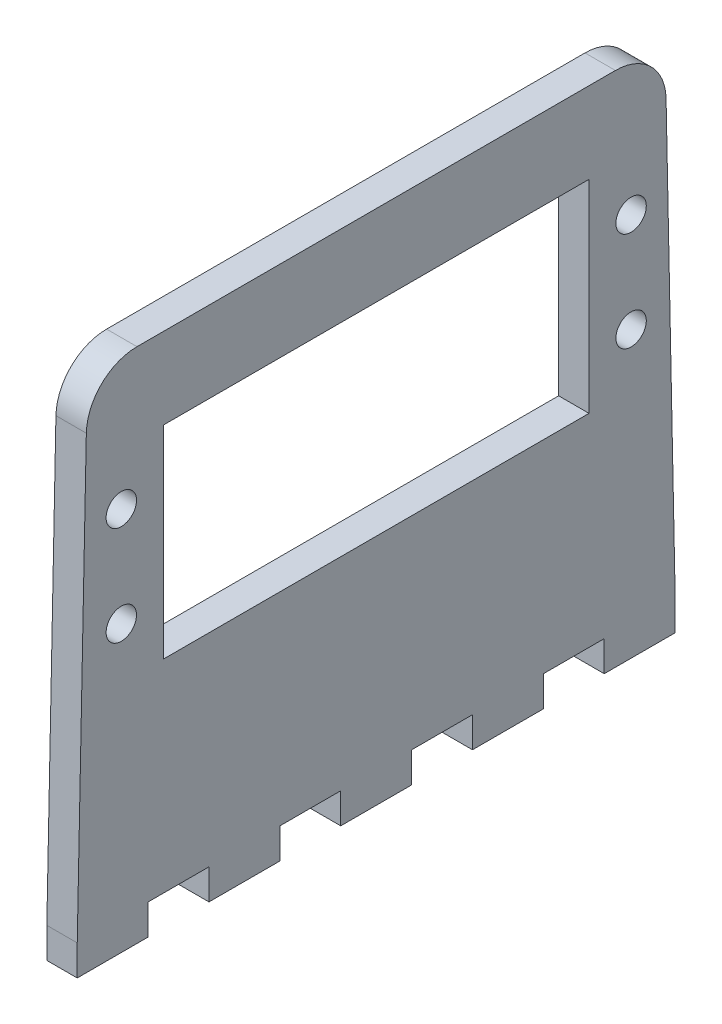
ISO-10303-21;
HEADER;
FILE_DESCRIPTION(('STEP AP214'),'2;1');
FILE_NAME('part.step','',(''),(''),'','','');
FILE_SCHEMA(('AUTOMOTIVE_DESIGN { 1 0 10303 214 1 1 1 1 }'));
ENDSEC;
DATA;
#1=APPLICATION_CONTEXT('core data for automotive mechanical design processes');
#2=APPLICATION_PROTOCOL_DEFINITION('international standard','automotive_design',2000,#1);
#3=PRODUCT_CONTEXT('',#1,'mechanical');
#4=PRODUCT('Part','Part','',(#3));
#5=PRODUCT_RELATED_PRODUCT_CATEGORY('part','',(#4));
#6=PRODUCT_DEFINITION_FORMATION('','',#4);
#7=PRODUCT_DEFINITION_CONTEXT('part definition',#1,'design');
#8=PRODUCT_DEFINITION('design','',#6,#7);
#9=PRODUCT_DEFINITION_SHAPE('','',#8);
#10=(LENGTH_UNIT() NAMED_UNIT(*) SI_UNIT(.MILLI.,.METRE.));
#11=(NAMED_UNIT(*) PLANE_ANGLE_UNIT() SI_UNIT($,.RADIAN.));
#12=(NAMED_UNIT(*) SI_UNIT($,.STERADIAN.) SOLID_ANGLE_UNIT());
#13=UNCERTAINTY_MEASURE_WITH_UNIT(LENGTH_MEASURE(1.E-05),#10,'distance_accuracy_value','');
#14=(GEOMETRIC_REPRESENTATION_CONTEXT(3) GLOBAL_UNCERTAINTY_ASSIGNED_CONTEXT((#13)) GLOBAL_UNIT_ASSIGNED_CONTEXT((#10,
#11,#12)) REPRESENTATION_CONTEXT('',''));
#15=CARTESIAN_POINT('',(0.,0.,0.));
#16=DIRECTION('',(0.,0.,1.));
#17=DIRECTION('',(1.,0.,0.));
#18=AXIS2_PLACEMENT_3D('',#15,#16,#17);
#19=CARTESIAN_POINT('',(3.,0.,0.));
#20=DIRECTION('',(-1.,0.,0.));
#21=DIRECTION('',(0.,0.,1.));
#22=AXIS2_PLACEMENT_3D('',#19,#20,#21);
#23=PLANE('',#22);
#24=DIRECTION('',(0.,0.,1.));
#25=VECTOR('',#24,1.);
#26=CARTESIAN_POINT('',(3.,48.,32.));
#27=LINE('',#26,#25);
#28=CARTESIAN_POINT('',(3.,48.,-20.1030817149342));
#29=VERTEX_POINT('',#28);
#30=CARTESIAN_POINT('',(3.,48.,27.1030817149343));
#31=VERTEX_POINT('',#30);
#32=EDGE_CURVE('E307',#29,#31,#27,.T.);
#33=ORIENTED_EDGE('',*,*,#32,.T.);
#34=CARTESIAN_POINT('',(3.,43.,27.1030817149343));
#35=DIRECTION('',(-1.,0.,0.));
#36=DIRECTION('',(0.,0.,1.));
#37=AXIS2_PLACEMENT_3D('',#34,#35,#36);
#38=CIRCLE('',#37,5.);
#39=CARTESIAN_POINT('',(3.,43.1041440684092,32.1019969985748));
#40=VERTEX_POINT('',#39);
#41=EDGE_CURVE('E41',#31,#40,#38,.F.);
#42=ORIENTED_EDGE('',*,*,#41,.T.);
#43=DIRECTION('',(0.,-0.999783056728112,0.0208288136818384));
#44=VECTOR('',#43,1.);
#45=CARTESIAN_POINT('',(3.,0.,33.0000000000001));
#46=LINE('',#45,#44);
#47=CARTESIAN_POINT('',(3.,0.,33.0000000000001));
#48=VERTEX_POINT('',#47);
#49=EDGE_CURVE('E309',#40,#48,#46,.T.);
#50=ORIENTED_EDGE('',*,*,#49,.T.);
#51=DIRECTION('',(0.,-1.,0.));
#52=VECTOR('',#51,1.);
#53=CARTESIAN_POINT('',(3.,-3.,33.0000000000001));
#54=LINE('',#53,#52);
#55=CARTESIAN_POINT('',(3.,-3.,33.0000000000001));
#56=VERTEX_POINT('',#55);
#57=EDGE_CURVE('E265',#48,#56,#54,.T.);
#58=ORIENTED_EDGE('',*,*,#57,.T.);
#59=DIRECTION('',(0.,0.,-1.));
#60=VECTOR('',#59,1.);
#61=CARTESIAN_POINT('',(3.,-3.,26.0000000000001));
#62=LINE('',#61,#60);
#63=CARTESIAN_POINT('',(3.,-3.,26.0000000000001));
#64=VERTEX_POINT('',#63);
#65=EDGE_CURVE('E268',#56,#64,#62,.T.);
#66=ORIENTED_EDGE('',*,*,#65,.T.);
#67=DIRECTION('',(0.,1.,0.));
#68=VECTOR('',#67,1.);
#69=CARTESIAN_POINT('',(3.,0.,26.0000000000001));
#70=LINE('',#69,#68);
#71=CARTESIAN_POINT('',(3.,0.,26.0000000000001));
#72=VERTEX_POINT('',#71);
#73=EDGE_CURVE('E271',#64,#72,#70,.T.);
#74=ORIENTED_EDGE('',*,*,#73,.T.);
#75=DIRECTION('',(0.,0.,-1.));
#76=VECTOR('',#75,1.);
#77=CARTESIAN_POINT('',(3.,0.,20.0000000000001));
#78=LINE('',#77,#76);
#79=CARTESIAN_POINT('',(3.,0.,20.0000000000001));
#80=VERTEX_POINT('',#79);
#81=EDGE_CURVE('E273',#72,#80,#78,.T.);
#82=ORIENTED_EDGE('',*,*,#81,.T.);
#83=DIRECTION('',(0.,-1.,0.));
#84=VECTOR('',#83,1.);
#85=CARTESIAN_POINT('',(3.,-3.,20.0000000000001));
#86=LINE('',#85,#84);
#87=CARTESIAN_POINT('',(3.,-3.,20.0000000000001));
#88=VERTEX_POINT('',#87);
#89=EDGE_CURVE('E275',#80,#88,#86,.T.);
#90=ORIENTED_EDGE('',*,*,#89,.T.);
#91=DIRECTION('',(0.,0.,-1.));
#92=VECTOR('',#91,1.);
#93=CARTESIAN_POINT('',(3.,-3.,13.0000000000001));
#94=LINE('',#93,#92);
#95=CARTESIAN_POINT('',(3.,-3.,13.0000000000001));
#96=VERTEX_POINT('',#95);
#97=EDGE_CURVE('E277',#88,#96,#94,.T.);
#98=ORIENTED_EDGE('',*,*,#97,.T.);
#99=DIRECTION('',(0.,1.,0.));
#100=VECTOR('',#99,1.);
#101=CARTESIAN_POINT('',(3.,0.,13.0000000000001));
#102=LINE('',#101,#100);
#103=CARTESIAN_POINT('',(3.,0.,13.0000000000001));
#104=VERTEX_POINT('',#103);
#105=EDGE_CURVE('E279',#96,#104,#102,.T.);
#106=ORIENTED_EDGE('',*,*,#105,.T.);
#107=DIRECTION('',(0.,0.,-1.));
#108=VECTOR('',#107,1.);
#109=CARTESIAN_POINT('',(3.,0.,7.00000000000027));
#110=LINE('',#109,#108);
#111=CARTESIAN_POINT('',(3.,0.,7.00000000000027));
#112=VERTEX_POINT('',#111);
#113=EDGE_CURVE('E281',#104,#112,#110,.T.);
#114=ORIENTED_EDGE('',*,*,#113,.T.);
#115=DIRECTION('',(0.,-1.,0.));
#116=VECTOR('',#115,1.);
#117=CARTESIAN_POINT('',(3.,-3.,7.00000000000018));
#118=LINE('',#117,#116);
#119=CARTESIAN_POINT('',(3.,-3.,7.00000000000018));
#120=VERTEX_POINT('',#119);
#121=EDGE_CURVE('E283',#112,#120,#118,.T.);
#122=ORIENTED_EDGE('',*,*,#121,.T.);
#123=DIRECTION('',(0.,0.,-1.));
#124=VECTOR('',#123,1.);
#125=CARTESIAN_POINT('',(3.,-3.,0.));
#126=LINE('',#125,#124);
#127=CARTESIAN_POINT('',(3.,-3.,0.));
#128=VERTEX_POINT('',#127);
#129=EDGE_CURVE('E285',#120,#128,#126,.T.);
#130=ORIENTED_EDGE('',*,*,#129,.T.);
#131=DIRECTION('',(0.,1.,0.));
#132=VECTOR('',#131,1.);
#133=CARTESIAN_POINT('',(3.,0.,0.));
#134=LINE('',#133,#132);
#135=CARTESIAN_POINT('',(3.,0.,0.));
#136=VERTEX_POINT('',#135);
#137=EDGE_CURVE('E287',#128,#136,#134,.T.);
#138=ORIENTED_EDGE('',*,*,#137,.T.);
#139=DIRECTION('',(0.,0.,-1.));
#140=VECTOR('',#139,1.);
#141=CARTESIAN_POINT('',(3.,0.,-6.00000000000001));
#142=LINE('',#141,#140);
#143=CARTESIAN_POINT('',(3.,0.,-6.00000000000001));
#144=VERTEX_POINT('',#143);
#145=EDGE_CURVE('E289',#136,#144,#142,.T.);
#146=ORIENTED_EDGE('',*,*,#145,.T.);
#147=DIRECTION('',(0.,-1.,0.));
#148=VECTOR('',#147,1.);
#149=CARTESIAN_POINT('',(3.,-3.,-6.00000000000001));
#150=LINE('',#149,#148);
#151=CARTESIAN_POINT('',(3.,-3.,-6.00000000000001));
#152=VERTEX_POINT('',#151);
#153=EDGE_CURVE('E291',#144,#152,#150,.T.);
#154=ORIENTED_EDGE('',*,*,#153,.T.);
#155=DIRECTION('',(0.,0.,-1.));
#156=VECTOR('',#155,1.);
#157=CARTESIAN_POINT('',(3.,-3.,-13.));
#158=LINE('',#157,#156);
#159=CARTESIAN_POINT('',(3.,-3.,-13.));
#160=VERTEX_POINT('',#159);
#161=EDGE_CURVE('E293',#152,#160,#158,.T.);
#162=ORIENTED_EDGE('',*,*,#161,.T.);
#163=DIRECTION('',(0.,1.,0.));
#164=VECTOR('',#163,1.);
#165=CARTESIAN_POINT('',(3.,0.,-13.));
#166=LINE('',#165,#164);
#167=CARTESIAN_POINT('',(3.,0.,-13.));
#168=VERTEX_POINT('',#167);
#169=EDGE_CURVE('E295',#160,#168,#166,.T.);
#170=ORIENTED_EDGE('',*,*,#169,.T.);
#171=DIRECTION('',(0.,0.,-1.));
#172=VECTOR('',#171,1.);
#173=CARTESIAN_POINT('',(3.,0.,-19.));
#174=LINE('',#173,#172);
#175=CARTESIAN_POINT('',(3.,0.,-19.));
#176=VERTEX_POINT('',#175);
#177=EDGE_CURVE('E297',#168,#176,#174,.T.);
#178=ORIENTED_EDGE('',*,*,#177,.T.);
#179=DIRECTION('',(0.,-1.,0.));
#180=VECTOR('',#179,1.);
#181=CARTESIAN_POINT('',(3.,-3.,-19.));
#182=LINE('',#181,#180);
#183=CARTESIAN_POINT('',(3.,-3.,-19.));
#184=VERTEX_POINT('',#183);
#185=EDGE_CURVE('E299',#176,#184,#182,.T.);
#186=ORIENTED_EDGE('',*,*,#185,.T.);
#187=DIRECTION('',(0.,0.,-1.));
#188=VECTOR('',#187,1.);
#189=CARTESIAN_POINT('',(3.,-3.,-26.));
#190=LINE('',#189,#188);
#191=CARTESIAN_POINT('',(3.,-3.,-26.));
#192=VERTEX_POINT('',#191);
#193=EDGE_CURVE('E301',#184,#192,#190,.T.);
#194=ORIENTED_EDGE('',*,*,#193,.T.);
#195=DIRECTION('',(0.,1.,0.));
#196=VECTOR('',#195,1.);
#197=CARTESIAN_POINT('',(3.,0.,-26.0000000000001));
#198=LINE('',#197,#196);
#199=CARTESIAN_POINT('',(3.,0.,-26.0000000000001));
#200=VERTEX_POINT('',#199);
#201=EDGE_CURVE('E303',#192,#200,#198,.T.);
#202=ORIENTED_EDGE('',*,*,#201,.T.);
#203=DIRECTION('',(0.,0.999783056728112,0.0208288136818374));
#204=VECTOR('',#203,1.);
#205=CARTESIAN_POINT('',(3.,48.,-25.));
#206=LINE('',#205,#204);
#207=CARTESIAN_POINT('',(3.,43.1041440684092,-25.1019969985748));
#208=VERTEX_POINT('',#207);
#209=EDGE_CURVE('E305',#200,#208,#206,.T.);
#210=ORIENTED_EDGE('',*,*,#209,.T.);
#211=CARTESIAN_POINT('',(3.,43.,-20.1030817149343));
#212=DIRECTION('',(-1.,0.,0.));
#213=DIRECTION('',(0.,0.,1.));
#214=AXIS2_PLACEMENT_3D('',#211,#212,#213);
#215=CIRCLE('',#214,5.);
#216=EDGE_CURVE('E425',#208,#29,#215,.F.);
#217=ORIENTED_EDGE('',*,*,#216,.T.);
#218=EDGE_LOOP('',(#33,#42,#50,#58,#66,#74,#82,#90,#98,#106,#114,#122,#130,#138,#146,#154,#162,
#170,#178,#186,#194,#202,#210,#217));
#219=FACE_BOUND('',#218,.T.);
#220=DIRECTION('',(0.,1.,0.));
#221=VECTOR('',#220,1.);
#222=CARTESIAN_POINT('',(3.,40.,-17.5));
#223=LINE('',#222,#221);
#224=CARTESIAN_POINT('',(3.,20.,-17.5));
#225=VERTEX_POINT('',#224);
#226=CARTESIAN_POINT('',(3.,40.,-17.5));
#227=VERTEX_POINT('',#226);
#228=EDGE_CURVE('E221',#225,#227,#223,.T.);
#229=ORIENTED_EDGE('',*,*,#228,.F.);
#230=DIRECTION('',(0.,0.,-1.));
#231=VECTOR('',#230,1.);
#232=CARTESIAN_POINT('',(3.,20.,24.5));
#233=LINE('',#232,#231);
#234=CARTESIAN_POINT('',(3.,20.,24.5));
#235=VERTEX_POINT('',#234);
#236=EDGE_CURVE('E247',#235,#225,#233,.T.);
#237=ORIENTED_EDGE('',*,*,#236,.F.);
#238=DIRECTION('',(0.,-1.,0.));
#239=VECTOR('',#238,1.);
#240=CARTESIAN_POINT('',(3.,40.,24.5));
#241=LINE('',#240,#239);
#242=CARTESIAN_POINT('',(3.,40.,24.5));
#243=VERTEX_POINT('',#242);
#244=EDGE_CURVE('E245',#243,#235,#241,.T.);
#245=ORIENTED_EDGE('',*,*,#244,.F.);
#246=DIRECTION('',(0.,0.,1.));
#247=VECTOR('',#246,1.);
#248=CARTESIAN_POINT('',(3.,40.,24.5));
#249=LINE('',#248,#247);
#250=EDGE_CURVE('E231',#227,#243,#249,.T.);
#251=ORIENTED_EDGE('',*,*,#250,.F.);
#252=EDGE_LOOP('',(#229,#237,#245,#251));
#253=FACE_BOUND('',#252,.T.);
#254=CARTESIAN_POINT('',(3.,34.9,-21.65));
#255=DIRECTION('',(1.,0.,0.));
#256=DIRECTION('',(0.,0.,-1.));
#257=AXIS2_PLACEMENT_3D('',#254,#255,#256);
#258=CIRCLE('',#257,1.5);
#259=CARTESIAN_POINT('',(3.,34.9,-23.15));
#260=VERTEX_POINT('',#259);
#261=EDGE_CURVE('E254',#260,#260,#258,.T.);
#262=ORIENTED_EDGE('',*,*,#261,.F.);
#263=EDGE_LOOP('',(#262));
#264=FACE_BOUND('',#263,.T.);
#265=CARTESIAN_POINT('',(3.,25.1,-21.65));
#266=DIRECTION('',(1.,0.,0.));
#267=DIRECTION('',(0.,0.,1.));
#268=AXIS2_PLACEMENT_3D('',#265,#266,#267);
#269=CIRCLE('',#268,1.5);
#270=CARTESIAN_POINT('',(3.,25.1,-20.15));
#271=VERTEX_POINT('',#270);
#272=EDGE_CURVE('E840',#271,#271,#269,.T.);
#273=ORIENTED_EDGE('',*,*,#272,.F.);
#274=EDGE_LOOP('',(#273));
#275=FACE_BOUND('',#274,.T.);
#276=CARTESIAN_POINT('',(3.,34.9,28.65));
#277=DIRECTION('',(1.,0.,0.));
#278=DIRECTION('',(0.,0.,1.));
#279=AXIS2_PLACEMENT_3D('',#276,#277,#278);
#280=CIRCLE('',#279,1.5);
#281=CARTESIAN_POINT('',(3.,34.9,30.15));
#282=VERTEX_POINT('',#281);
#283=EDGE_CURVE('E834',#282,#282,#280,.T.);
#284=ORIENTED_EDGE('',*,*,#283,.F.);
#285=EDGE_LOOP('',(#284));
#286=FACE_BOUND('',#285,.T.);
#287=CARTESIAN_POINT('',(3.,25.1,28.65));
#288=DIRECTION('',(1.,0.,0.));
#289=DIRECTION('',(0.,0.,-1.));
#290=AXIS2_PLACEMENT_3D('',#287,#288,#289);
#291=CIRCLE('',#290,1.5);
#292=CARTESIAN_POINT('',(3.,25.1,27.15));
#293=VERTEX_POINT('',#292);
#294=EDGE_CURVE('E825',#293,#293,#291,.T.);
#295=ORIENTED_EDGE('',*,*,#294,.F.);
#296=EDGE_LOOP('',(#295));
#297=FACE_BOUND('',#296,.T.);
#298=ADVANCED_FACE('F33',(#219,#253,#264,#275,#286,#297),#23,.F.);
#299=CARTESIAN_POINT('',(0.,0.,0.));
#300=DIRECTION('',(-1.,0.,0.));
#301=DIRECTION('',(0.,0.,1.));
#302=AXIS2_PLACEMENT_3D('',#299,#300,#301);
#303=PLANE('',#302);
#304=CARTESIAN_POINT('',(0.,34.9,28.65));
#305=DIRECTION('',(1.,0.,0.));
#306=DIRECTION('',(0.,0.,1.));
#307=AXIS2_PLACEMENT_3D('',#304,#305,#306);
#308=CIRCLE('',#307,1.5);
#309=CARTESIAN_POINT('',(0.,34.9,30.15));
#310=VERTEX_POINT('',#309);
#311=EDGE_CURVE('E831',#310,#310,#308,.T.);
#312=ORIENTED_EDGE('',*,*,#311,.T.);
#313=EDGE_LOOP('',(#312));
#314=FACE_BOUND('',#313,.T.);
#315=CARTESIAN_POINT('',(0.,34.9,-21.65));
#316=DIRECTION('',(1.,0.,0.));
#317=DIRECTION('',(0.,0.,-1.));
#318=AXIS2_PLACEMENT_3D('',#315,#316,#317);
#319=CIRCLE('',#318,1.5);
#320=CARTESIAN_POINT('',(0.,34.9,-23.15));
#321=VERTEX_POINT('',#320);
#322=EDGE_CURVE('E843',#321,#321,#319,.T.);
#323=ORIENTED_EDGE('',*,*,#322,.T.);
#324=EDGE_LOOP('',(#323));
#325=FACE_BOUND('',#324,.T.);
#326=DIRECTION('',(0.,-0.999783056728112,0.0208288136818384));
#327=VECTOR('',#326,1.);
#328=CARTESIAN_POINT('',(0.,0.,33.0000000000001));
#329=LINE('',#328,#327);
#330=CARTESIAN_POINT('',(0.,43.1041440684092,32.1019969985748));
#331=VERTEX_POINT('',#330);
#332=CARTESIAN_POINT('',(0.,0.,33.0000000000001));
#333=VERTEX_POINT('',#332);
#334=EDGE_CURVE('E269',#331,#333,#329,.T.);
#335=ORIENTED_EDGE('',*,*,#334,.F.);
#336=CARTESIAN_POINT('',(0.,43.,27.1030817149343));
#337=DIRECTION('',(-1.,0.,0.));
#338=DIRECTION('',(0.,0.,1.));
#339=AXIS2_PLACEMENT_3D('',#336,#337,#338);
#340=CIRCLE('',#339,5.);
#341=CARTESIAN_POINT('',(0.,48.,27.1030817149343));
#342=VERTEX_POINT('',#341);
#343=EDGE_CURVE('E419',#331,#342,#340,.T.);
#344=ORIENTED_EDGE('',*,*,#343,.T.);
#345=DIRECTION('',(0.,0.,1.));
#346=VECTOR('',#345,1.);
#347=CARTESIAN_POINT('',(0.,48.,32.));
#348=LINE('',#347,#346);
#349=CARTESIAN_POINT('',(0.,48.,-20.1030817149342));
#350=VERTEX_POINT('',#349);
#351=EDGE_CURVE('E352',#350,#342,#348,.T.);
#352=ORIENTED_EDGE('',*,*,#351,.F.);
#353=CARTESIAN_POINT('',(0.,43.,-20.1030817149343));
#354=DIRECTION('',(-1.,0.,0.));
#355=DIRECTION('',(0.,0.,1.));
#356=AXIS2_PLACEMENT_3D('',#353,#354,#355);
#357=CIRCLE('',#356,5.);
#358=CARTESIAN_POINT('',(0.,43.1041440684092,-25.1019969985748));
#359=VERTEX_POINT('',#358);
#360=EDGE_CURVE('E417',#350,#359,#357,.T.);
#361=ORIENTED_EDGE('',*,*,#360,.T.);
#362=DIRECTION('',(0.,0.999783056728112,0.0208288136818374));
#363=VECTOR('',#362,1.);
#364=CARTESIAN_POINT('',(0.,48.,-25.));
#365=LINE('',#364,#363);
#366=CARTESIAN_POINT('',(0.,0.,-26.0000000000001));
#367=VERTEX_POINT('',#366);
#368=EDGE_CURVE('E350',#367,#359,#365,.T.);
#369=ORIENTED_EDGE('',*,*,#368,.F.);
#370=DIRECTION('',(0.,1.,0.));
#371=VECTOR('',#370,1.);
#372=CARTESIAN_POINT('',(0.,0.,-26.0000000000001));
#373=LINE('',#372,#371);
#374=CARTESIAN_POINT('',(0.,-3.,-26.));
#375=VERTEX_POINT('',#374);
#376=EDGE_CURVE('E348',#375,#367,#373,.T.);
#377=ORIENTED_EDGE('',*,*,#376,.F.);
#378=DIRECTION('',(0.,0.,-1.));
#379=VECTOR('',#378,1.);
#380=CARTESIAN_POINT('',(0.,-3.,-26.));
#381=LINE('',#380,#379);
#382=CARTESIAN_POINT('',(0.,-3.,-19.));
#383=VERTEX_POINT('',#382);
#384=EDGE_CURVE('E346',#383,#375,#381,.T.);
#385=ORIENTED_EDGE('',*,*,#384,.F.);
#386=DIRECTION('',(0.,-1.,0.));
#387=VECTOR('',#386,1.);
#388=CARTESIAN_POINT('',(0.,-3.,-19.));
#389=LINE('',#388,#387);
#390=CARTESIAN_POINT('',(0.,0.,-19.));
#391=VERTEX_POINT('',#390);
#392=EDGE_CURVE('E344',#391,#383,#389,.T.);
#393=ORIENTED_EDGE('',*,*,#392,.F.);
#394=DIRECTION('',(0.,0.,-1.));
#395=VECTOR('',#394,1.);
#396=CARTESIAN_POINT('',(0.,0.,-19.));
#397=LINE('',#396,#395);
#398=CARTESIAN_POINT('',(0.,0.,-13.));
#399=VERTEX_POINT('',#398);
#400=EDGE_CURVE('E342',#399,#391,#397,.T.);
#401=ORIENTED_EDGE('',*,*,#400,.F.);
#402=DIRECTION('',(0.,1.,0.));
#403=VECTOR('',#402,1.);
#404=CARTESIAN_POINT('',(0.,0.,-13.));
#405=LINE('',#404,#403);
#406=CARTESIAN_POINT('',(0.,-3.,-13.));
#407=VERTEX_POINT('',#406);
#408=EDGE_CURVE('E340',#407,#399,#405,.T.);
#409=ORIENTED_EDGE('',*,*,#408,.F.);
#410=DIRECTION('',(0.,0.,-1.));
#411=VECTOR('',#410,1.);
#412=CARTESIAN_POINT('',(0.,-3.,-13.));
#413=LINE('',#412,#411);
#414=CARTESIAN_POINT('',(0.,-3.,-6.00000000000001));
#415=VERTEX_POINT('',#414);
#416=EDGE_CURVE('E338',#415,#407,#413,.T.);
#417=ORIENTED_EDGE('',*,*,#416,.F.);
#418=DIRECTION('',(0.,-1.,0.));
#419=VECTOR('',#418,1.);
#420=CARTESIAN_POINT('',(0.,-3.,-6.00000000000001));
#421=LINE('',#420,#419);
#422=CARTESIAN_POINT('',(0.,0.,-6.00000000000001));
#423=VERTEX_POINT('',#422);
#424=EDGE_CURVE('E336',#423,#415,#421,.T.);
#425=ORIENTED_EDGE('',*,*,#424,.F.);
#426=DIRECTION('',(0.,0.,-1.));
#427=VECTOR('',#426,1.);
#428=CARTESIAN_POINT('',(0.,0.,-6.00000000000001));
#429=LINE('',#428,#427);
#430=CARTESIAN_POINT('',(0.,0.,0.));
#431=VERTEX_POINT('',#430);
#432=EDGE_CURVE('E334',#431,#423,#429,.T.);
#433=ORIENTED_EDGE('',*,*,#432,.F.);
#434=DIRECTION('',(0.,1.,0.));
#435=VECTOR('',#434,1.);
#436=CARTESIAN_POINT('',(0.,0.,0.));
#437=LINE('',#436,#435);
#438=CARTESIAN_POINT('',(0.,-3.,0.));
#439=VERTEX_POINT('',#438);
#440=EDGE_CURVE('E332',#439,#431,#437,.T.);
#441=ORIENTED_EDGE('',*,*,#440,.F.);
#442=DIRECTION('',(0.,0.,-1.));
#443=VECTOR('',#442,1.);
#444=CARTESIAN_POINT('',(0.,-3.,0.));
#445=LINE('',#444,#443);
#446=CARTESIAN_POINT('',(0.,-3.,7.00000000000018));
#447=VERTEX_POINT('',#446);
#448=EDGE_CURVE('E330',#447,#439,#445,.T.);
#449=ORIENTED_EDGE('',*,*,#448,.F.);
#450=DIRECTION('',(0.,-1.,0.));
#451=VECTOR('',#450,1.);
#452=CARTESIAN_POINT('',(0.,-3.,7.00000000000018));
#453=LINE('',#452,#451);
#454=CARTESIAN_POINT('',(0.,0.,7.00000000000027));
#455=VERTEX_POINT('',#454);
#456=EDGE_CURVE('E328',#455,#447,#453,.T.);
#457=ORIENTED_EDGE('',*,*,#456,.F.);
#458=DIRECTION('',(0.,0.,-1.));
#459=VECTOR('',#458,1.);
#460=CARTESIAN_POINT('',(0.,0.,7.00000000000027));
#461=LINE('',#460,#459);
#462=CARTESIAN_POINT('',(0.,0.,13.0000000000001));
#463=VERTEX_POINT('',#462);
#464=EDGE_CURVE('E326',#463,#455,#461,.T.);
#465=ORIENTED_EDGE('',*,*,#464,.F.);
#466=DIRECTION('',(0.,1.,0.));
#467=VECTOR('',#466,1.);
#468=CARTESIAN_POINT('',(0.,0.,13.0000000000001));
#469=LINE('',#468,#467);
#470=CARTESIAN_POINT('',(0.,-3.,13.0000000000001));
#471=VERTEX_POINT('',#470);
#472=EDGE_CURVE('E324',#471,#463,#469,.T.);
#473=ORIENTED_EDGE('',*,*,#472,.F.);
#474=DIRECTION('',(0.,0.,-1.));
#475=VECTOR('',#474,1.);
#476=CARTESIAN_POINT('',(0.,-3.,13.0000000000001));
#477=LINE('',#476,#475);
#478=CARTESIAN_POINT('',(0.,-3.,20.0000000000001));
#479=VERTEX_POINT('',#478);
#480=EDGE_CURVE('E322',#479,#471,#477,.T.);
#481=ORIENTED_EDGE('',*,*,#480,.F.);
#482=DIRECTION('',(0.,-1.,0.));
#483=VECTOR('',#482,1.);
#484=CARTESIAN_POINT('',(0.,-3.,20.0000000000001));
#485=LINE('',#484,#483);
#486=CARTESIAN_POINT('',(0.,0.,20.0000000000001));
#487=VERTEX_POINT('',#486);
#488=EDGE_CURVE('E320',#487,#479,#485,.T.);
#489=ORIENTED_EDGE('',*,*,#488,.F.);
#490=DIRECTION('',(0.,0.,-1.));
#491=VECTOR('',#490,1.);
#492=CARTESIAN_POINT('',(0.,0.,20.0000000000001));
#493=LINE('',#492,#491);
#494=CARTESIAN_POINT('',(0.,0.,26.0000000000001));
#495=VERTEX_POINT('',#494);
#496=EDGE_CURVE('E318',#495,#487,#493,.T.);
#497=ORIENTED_EDGE('',*,*,#496,.F.);
#498=DIRECTION('',(0.,1.,0.));
#499=VECTOR('',#498,1.);
#500=CARTESIAN_POINT('',(0.,0.,26.0000000000001));
#501=LINE('',#500,#499);
#502=CARTESIAN_POINT('',(0.,-3.,26.0000000000001));
#503=VERTEX_POINT('',#502);
#504=EDGE_CURVE('E316',#503,#495,#501,.T.);
#505=ORIENTED_EDGE('',*,*,#504,.F.);
#506=DIRECTION('',(0.,0.,-1.));
#507=VECTOR('',#506,1.);
#508=CARTESIAN_POINT('',(0.,-3.,26.0000000000001));
#509=LINE('',#508,#507);
#510=CARTESIAN_POINT('',(0.,-3.,33.0000000000001));
#511=VERTEX_POINT('',#510);
#512=EDGE_CURVE('E314',#511,#503,#509,.T.);
#513=ORIENTED_EDGE('',*,*,#512,.F.);
#514=DIRECTION('',(0.,-1.,0.));
#515=VECTOR('',#514,1.);
#516=CARTESIAN_POINT('',(0.,-3.,33.0000000000001));
#517=LINE('',#516,#515);
#518=EDGE_CURVE('E239',#333,#511,#517,.T.);
#519=ORIENTED_EDGE('',*,*,#518,.F.);
#520=EDGE_LOOP('',(#335,#344,#352,#361,#369,#377,#385,#393,#401,#409,#417,#425,#433,#441,#449,
#457,#465,#473,#481,#489,#497,#505,#513,#519));
#521=FACE_BOUND('',#520,.T.);
#522=DIRECTION('',(0.,0.,-1.));
#523=VECTOR('',#522,1.);
#524=CARTESIAN_POINT('',(0.,20.,24.5));
#525=LINE('',#524,#523);
#526=CARTESIAN_POINT('',(0.,20.,24.5));
#527=VERTEX_POINT('',#526);
#528=CARTESIAN_POINT('',(0.,20.,-17.5));
#529=VERTEX_POINT('',#528);
#530=EDGE_CURVE('E232',#527,#529,#525,.T.);
#531=ORIENTED_EDGE('',*,*,#530,.T.);
#532=DIRECTION('',(0.,1.,0.));
#533=VECTOR('',#532,1.);
#534=CARTESIAN_POINT('',(0.,40.,-17.5));
#535=LINE('',#534,#533);
#536=CARTESIAN_POINT('',(0.,40.,-17.5));
#537=VERTEX_POINT('',#536);
#538=EDGE_CURVE('E252',#529,#537,#535,.T.);
#539=ORIENTED_EDGE('',*,*,#538,.T.);
#540=DIRECTION('',(0.,0.,1.));
#541=VECTOR('',#540,1.);
#542=CARTESIAN_POINT('',(0.,40.,24.5));
#543=LINE('',#542,#541);
#544=CARTESIAN_POINT('',(0.,40.,24.5));
#545=VERTEX_POINT('',#544);
#546=EDGE_CURVE('E238',#537,#545,#543,.T.);
#547=ORIENTED_EDGE('',*,*,#546,.T.);
#548=DIRECTION('',(0.,-1.,0.));
#549=VECTOR('',#548,1.);
#550=CARTESIAN_POINT('',(0.,40.,24.5));
#551=LINE('',#550,#549);
#552=EDGE_CURVE('E256',#545,#527,#551,.T.);
#553=ORIENTED_EDGE('',*,*,#552,.T.);
#554=EDGE_LOOP('',(#531,#539,#547,#553));
#555=FACE_BOUND('',#554,.T.);
#556=CARTESIAN_POINT('',(0.,25.1,-21.65));
#557=DIRECTION('',(1.,0.,0.));
#558=DIRECTION('',(0.,0.,1.));
#559=AXIS2_PLACEMENT_3D('',#556,#557,#558);
#560=CIRCLE('',#559,1.5);
#561=CARTESIAN_POINT('',(0.,25.1,-20.15));
#562=VERTEX_POINT('',#561);
#563=EDGE_CURVE('E837',#562,#562,#560,.T.);
#564=ORIENTED_EDGE('',*,*,#563,.T.);
#565=EDGE_LOOP('',(#564));
#566=FACE_BOUND('',#565,.T.);
#567=CARTESIAN_POINT('',(0.,25.1,28.65));
#568=DIRECTION('',(1.,0.,0.));
#569=DIRECTION('',(0.,0.,-1.));
#570=AXIS2_PLACEMENT_3D('',#567,#568,#569);
#571=CIRCLE('',#570,1.5);
#572=CARTESIAN_POINT('',(0.,25.1,27.15));
#573=VERTEX_POINT('',#572);
#574=EDGE_CURVE('E828',#573,#573,#571,.T.);
#575=ORIENTED_EDGE('',*,*,#574,.T.);
#576=EDGE_LOOP('',(#575));
#577=FACE_BOUND('',#576,.T.);
#578=ADVANCED_FACE('F439',(#314,#325,#521,#555,#566,#577),#303,.T.);
#579=CARTESIAN_POINT('',(3.,-3.,33.0000000000001));
#580=DIRECTION('',(0.,0.,-1.));
#581=DIRECTION('',(0.,1.,0.));
#582=AXIS2_PLACEMENT_3D('',#579,#580,#581);
#583=PLANE('',#582);
#584=ORIENTED_EDGE('',*,*,#518,.T.);
#585=DIRECTION('',(-1.,0.,0.));
#586=VECTOR('',#585,1.);
#587=CARTESIAN_POINT('',(3.,-3.,33.0000000000001));
#588=LINE('',#587,#586);
#589=EDGE_CURVE('E411',#56,#511,#588,.T.);
#590=ORIENTED_EDGE('',*,*,#589,.F.);
#591=ORIENTED_EDGE('',*,*,#57,.F.);
#592=DIRECTION('',(-1.,0.,0.));
#593=VECTOR('',#592,1.);
#594=CARTESIAN_POINT('',(3.,0.,33.0000000000001));
#595=LINE('',#594,#593);
#596=EDGE_CURVE('E311',#48,#333,#595,.T.);
#597=ORIENTED_EDGE('',*,*,#596,.T.);
#598=EDGE_LOOP('',(#584,#590,#591,#597));
#599=FACE_BOUND('',#598,.T.);
#600=ADVANCED_FACE('F538',(#599),#583,.F.);
#601=CARTESIAN_POINT('',(3.,-3.,26.0000000000001));
#602=DIRECTION('',(0.,1.,0.));
#603=DIRECTION('',(0.,0.,1.));
#604=AXIS2_PLACEMENT_3D('',#601,#602,#603);
#605=PLANE('',#604);
#606=ORIENTED_EDGE('',*,*,#512,.T.);
#607=DIRECTION('',(-1.,0.,0.));
#608=VECTOR('',#607,1.);
#609=CARTESIAN_POINT('',(3.,-3.,26.0000000000001));
#610=LINE('',#609,#608);
#611=EDGE_CURVE('E408',#64,#503,#610,.T.);
#612=ORIENTED_EDGE('',*,*,#611,.F.);
#613=ORIENTED_EDGE('',*,*,#65,.F.);
#614=ORIENTED_EDGE('',*,*,#589,.T.);
#615=EDGE_LOOP('',(#606,#612,#613,#614));
#616=FACE_BOUND('',#615,.T.);
#617=ADVANCED_FACE('F535',(#616),#605,.F.);
#618=CARTESIAN_POINT('',(3.,0.,26.0000000000001));
#619=DIRECTION('',(0.,0.,1.));
#620=DIRECTION('',(1.,0.,0.));
#621=AXIS2_PLACEMENT_3D('',#618,#619,#620);
#622=PLANE('',#621);
#623=ORIENTED_EDGE('',*,*,#504,.T.);
#624=DIRECTION('',(-1.,0.,0.));
#625=VECTOR('',#624,1.);
#626=CARTESIAN_POINT('',(3.,0.,26.0000000000001));
#627=LINE('',#626,#625);
#628=EDGE_CURVE('E405',#72,#495,#627,.T.);
#629=ORIENTED_EDGE('',*,*,#628,.F.);
#630=ORIENTED_EDGE('',*,*,#73,.F.);
#631=ORIENTED_EDGE('',*,*,#611,.T.);
#632=EDGE_LOOP('',(#623,#629,#630,#631));
#633=FACE_BOUND('',#632,.T.);
#634=ADVANCED_FACE('F531',(#633),#622,.F.);
#635=CARTESIAN_POINT('',(3.,0.,20.0000000000001));
#636=DIRECTION('',(0.,1.,0.));
#637=DIRECTION('',(0.,0.,1.));
#638=AXIS2_PLACEMENT_3D('',#635,#636,#637);
#639=PLANE('',#638);
#640=ORIENTED_EDGE('',*,*,#496,.T.);
#641=DIRECTION('',(-1.,0.,0.));
#642=VECTOR('',#641,1.);
#643=CARTESIAN_POINT('',(3.,0.,20.0000000000001));
#644=LINE('',#643,#642);
#645=EDGE_CURVE('E402',#80,#487,#644,.T.);
#646=ORIENTED_EDGE('',*,*,#645,.F.);
#647=ORIENTED_EDGE('',*,*,#81,.F.);
#648=ORIENTED_EDGE('',*,*,#628,.T.);
#649=EDGE_LOOP('',(#640,#646,#647,#648));
#650=FACE_BOUND('',#649,.T.);
#651=ADVANCED_FACE('F527',(#650),#639,.F.);
#652=CARTESIAN_POINT('',(3.,-3.,20.0000000000001));
#653=DIRECTION('',(0.,0.,-1.));
#654=DIRECTION('',(-1.,0.,0.));
#655=AXIS2_PLACEMENT_3D('',#652,#653,#654);
#656=PLANE('',#655);
#657=ORIENTED_EDGE('',*,*,#488,.T.);
#658=DIRECTION('',(-1.,0.,0.));
#659=VECTOR('',#658,1.);
#660=CARTESIAN_POINT('',(3.,-3.,20.0000000000001));
#661=LINE('',#660,#659);
#662=EDGE_CURVE('E399',#88,#479,#661,.T.);
#663=ORIENTED_EDGE('',*,*,#662,.F.);
#664=ORIENTED_EDGE('',*,*,#89,.F.);
#665=ORIENTED_EDGE('',*,*,#645,.T.);
#666=EDGE_LOOP('',(#657,#663,#664,#665));
#667=FACE_BOUND('',#666,.T.);
#668=ADVANCED_FACE('F523',(#667),#656,.F.);
#669=CARTESIAN_POINT('',(3.,-3.,13.0000000000001));
#670=DIRECTION('',(0.,1.,0.));
#671=DIRECTION('',(0.,0.,1.));
#672=AXIS2_PLACEMENT_3D('',#669,#670,#671);
#673=PLANE('',#672);
#674=ORIENTED_EDGE('',*,*,#480,.T.);
#675=DIRECTION('',(-1.,0.,0.));
#676=VECTOR('',#675,1.);
#677=CARTESIAN_POINT('',(3.,-3.,13.0000000000001));
#678=LINE('',#677,#676);
#679=EDGE_CURVE('E396',#96,#471,#678,.T.);
#680=ORIENTED_EDGE('',*,*,#679,.F.);
#681=ORIENTED_EDGE('',*,*,#97,.F.);
#682=ORIENTED_EDGE('',*,*,#662,.T.);
#683=EDGE_LOOP('',(#674,#680,#681,#682));
#684=FACE_BOUND('',#683,.T.);
#685=ADVANCED_FACE('F518',(#684),#673,.F.);
#686=CARTESIAN_POINT('',(3.,0.,13.0000000000001));
#687=DIRECTION('',(0.,0.,1.));
#688=DIRECTION('',(1.,0.,0.));
#689=AXIS2_PLACEMENT_3D('',#686,#687,#688);
#690=PLANE('',#689);
#691=ORIENTED_EDGE('',*,*,#472,.T.);
#692=DIRECTION('',(-1.,0.,0.));
#693=VECTOR('',#692,1.);
#694=CARTESIAN_POINT('',(3.,0.,13.0000000000001));
#695=LINE('',#694,#693);
#696=EDGE_CURVE('E393',#104,#463,#695,.T.);
#697=ORIENTED_EDGE('',*,*,#696,.F.);
#698=ORIENTED_EDGE('',*,*,#105,.F.);
#699=ORIENTED_EDGE('',*,*,#679,.T.);
#700=EDGE_LOOP('',(#691,#697,#698,#699));
#701=FACE_BOUND('',#700,.T.);
#702=ADVANCED_FACE('F512',(#701),#690,.F.);
#703=CARTESIAN_POINT('',(3.,0.,7.00000000000027));
#704=DIRECTION('',(0.,1.,0.));
#705=DIRECTION('',(0.,0.,1.));
#706=AXIS2_PLACEMENT_3D('',#703,#704,#705);
#707=PLANE('',#706);
#708=ORIENTED_EDGE('',*,*,#464,.T.);
#709=DIRECTION('',(-1.,0.,0.));
#710=VECTOR('',#709,1.);
#711=CARTESIAN_POINT('',(3.,0.,7.00000000000027));
#712=LINE('',#711,#710);
#713=EDGE_CURVE('E390',#112,#455,#712,.T.);
#714=ORIENTED_EDGE('',*,*,#713,.F.);
#715=ORIENTED_EDGE('',*,*,#113,.F.);
#716=ORIENTED_EDGE('',*,*,#696,.T.);
#717=EDGE_LOOP('',(#708,#714,#715,#716));
#718=FACE_BOUND('',#717,.T.);
#719=ADVANCED_FACE('F508',(#718),#707,.F.);
#720=CARTESIAN_POINT('',(3.,-3.,7.00000000000018));
#721=DIRECTION('',(0.,0.,-1.));
#722=DIRECTION('',(0.,1.,0.));
#723=AXIS2_PLACEMENT_3D('',#720,#721,#722);
#724=PLANE('',#723);
#725=ORIENTED_EDGE('',*,*,#456,.T.);
#726=DIRECTION('',(-1.,0.,0.));
#727=VECTOR('',#726,1.);
#728=CARTESIAN_POINT('',(3.,-3.,7.00000000000018));
#729=LINE('',#728,#727);
#730=EDGE_CURVE('E387',#120,#447,#729,.T.);
#731=ORIENTED_EDGE('',*,*,#730,.F.);
#732=ORIENTED_EDGE('',*,*,#121,.F.);
#733=ORIENTED_EDGE('',*,*,#713,.T.);
#734=EDGE_LOOP('',(#725,#731,#732,#733));
#735=FACE_BOUND('',#734,.T.);
#736=ADVANCED_FACE('F503',(#735),#724,.F.);
#737=CARTESIAN_POINT('',(3.,-3.,0.));
#738=DIRECTION('',(0.,1.,0.));
#739=DIRECTION('',(0.,0.,1.));
#740=AXIS2_PLACEMENT_3D('',#737,#738,#739);
#741=PLANE('',#740);
#742=ORIENTED_EDGE('',*,*,#448,.T.);
#743=DIRECTION('',(-1.,0.,0.));
#744=VECTOR('',#743,1.);
#745=CARTESIAN_POINT('',(3.,-3.,0.));
#746=LINE('',#745,#744);
#747=EDGE_CURVE('E384',#128,#439,#746,.T.);
#748=ORIENTED_EDGE('',*,*,#747,.F.);
#749=ORIENTED_EDGE('',*,*,#129,.F.);
#750=ORIENTED_EDGE('',*,*,#730,.T.);
#751=EDGE_LOOP('',(#742,#748,#749,#750));
#752=FACE_BOUND('',#751,.T.);
#753=ADVANCED_FACE('F497',(#752),#741,.F.);
#754=CARTESIAN_POINT('',(3.,0.,0.));
#755=DIRECTION('',(0.,0.,1.));
#756=DIRECTION('',(0.,-1.,0.));
#757=AXIS2_PLACEMENT_3D('',#754,#755,#756);
#758=PLANE('',#757);
#759=ORIENTED_EDGE('',*,*,#440,.T.);
#760=DIRECTION('',(-1.,0.,0.));
#761=VECTOR('',#760,1.);
#762=CARTESIAN_POINT('',(3.,0.,0.));
#763=LINE('',#762,#761);
#764=EDGE_CURVE('E381',#136,#431,#763,.T.);
#765=ORIENTED_EDGE('',*,*,#764,.F.);
#766=ORIENTED_EDGE('',*,*,#137,.F.);
#767=ORIENTED_EDGE('',*,*,#747,.T.);
#768=EDGE_LOOP('',(#759,#765,#766,#767));
#769=FACE_BOUND('',#768,.T.);
#770=ADVANCED_FACE('F493',(#769),#758,.F.);
#771=CARTESIAN_POINT('',(3.,0.,-6.00000000000001));
#772=DIRECTION('',(0.,1.,0.));
#773=DIRECTION('',(0.,0.,1.));
#774=AXIS2_PLACEMENT_3D('',#771,#772,#773);
#775=PLANE('',#774);
#776=ORIENTED_EDGE('',*,*,#432,.T.);
#777=DIRECTION('',(-1.,0.,0.));
#778=VECTOR('',#777,1.);
#779=CARTESIAN_POINT('',(3.,0.,-6.00000000000001));
#780=LINE('',#779,#778);
#781=EDGE_CURVE('E378',#144,#423,#780,.T.);
#782=ORIENTED_EDGE('',*,*,#781,.F.);
#783=ORIENTED_EDGE('',*,*,#145,.F.);
#784=ORIENTED_EDGE('',*,*,#764,.T.);
#785=EDGE_LOOP('',(#776,#782,#783,#784));
#786=FACE_BOUND('',#785,.T.);
#787=ADVANCED_FACE('F488',(#786),#775,.F.);
#788=CARTESIAN_POINT('',(3.,-3.,-6.00000000000001));
#789=DIRECTION('',(0.,0.,-1.));
#790=DIRECTION('',(-1.,0.,0.));
#791=AXIS2_PLACEMENT_3D('',#788,#789,#790);
#792=PLANE('',#791);
#793=ORIENTED_EDGE('',*,*,#424,.T.);
#794=DIRECTION('',(-1.,0.,0.));
#795=VECTOR('',#794,1.);
#796=CARTESIAN_POINT('',(3.,-3.,-6.00000000000001));
#797=LINE('',#796,#795);
#798=EDGE_CURVE('E375',#152,#415,#797,.T.);
#799=ORIENTED_EDGE('',*,*,#798,.F.);
#800=ORIENTED_EDGE('',*,*,#153,.F.);
#801=ORIENTED_EDGE('',*,*,#781,.T.);
#802=EDGE_LOOP('',(#793,#799,#800,#801));
#803=FACE_BOUND('',#802,.T.);
#804=ADVANCED_FACE('F482',(#803),#792,.F.);
#805=CARTESIAN_POINT('',(3.,-3.,-13.));
#806=DIRECTION('',(0.,1.,0.));
#807=DIRECTION('',(0.,0.,1.));
#808=AXIS2_PLACEMENT_3D('',#805,#806,#807);
#809=PLANE('',#808);
#810=ORIENTED_EDGE('',*,*,#416,.T.);
#811=DIRECTION('',(-1.,0.,0.));
#812=VECTOR('',#811,1.);
#813=CARTESIAN_POINT('',(3.,-3.,-13.));
#814=LINE('',#813,#812);
#815=EDGE_CURVE('E372',#160,#407,#814,.T.);
#816=ORIENTED_EDGE('',*,*,#815,.F.);
#817=ORIENTED_EDGE('',*,*,#161,.F.);
#818=ORIENTED_EDGE('',*,*,#798,.T.);
#819=EDGE_LOOP('',(#810,#816,#817,#818));
#820=FACE_BOUND('',#819,.T.);
#821=ADVANCED_FACE('F478',(#820),#809,.F.);
#822=CARTESIAN_POINT('',(3.,0.,-13.));
#823=DIRECTION('',(0.,0.,1.));
#824=DIRECTION('',(0.,-1.,0.));
#825=AXIS2_PLACEMENT_3D('',#822,#823,#824);
#826=PLANE('',#825);
#827=ORIENTED_EDGE('',*,*,#408,.T.);
#828=DIRECTION('',(-1.,0.,0.));
#829=VECTOR('',#828,1.);
#830=CARTESIAN_POINT('',(3.,0.,-13.));
#831=LINE('',#830,#829);
#832=EDGE_CURVE('E369',#168,#399,#831,.T.);
#833=ORIENTED_EDGE('',*,*,#832,.F.);
#834=ORIENTED_EDGE('',*,*,#169,.F.);
#835=ORIENTED_EDGE('',*,*,#815,.T.);
#836=EDGE_LOOP('',(#827,#833,#834,#835));
#837=FACE_BOUND('',#836,.T.);
#838=ADVANCED_FACE('F473',(#837),#826,.F.);
#839=CARTESIAN_POINT('',(3.,0.,-19.));
#840=DIRECTION('',(0.,1.,0.));
#841=DIRECTION('',(0.,0.,1.));
#842=AXIS2_PLACEMENT_3D('',#839,#840,#841);
#843=PLANE('',#842);
#844=ORIENTED_EDGE('',*,*,#400,.T.);
#845=DIRECTION('',(-1.,0.,0.));
#846=VECTOR('',#845,1.);
#847=CARTESIAN_POINT('',(3.,0.,-19.));
#848=LINE('',#847,#846);
#849=EDGE_CURVE('E366',#176,#391,#848,.T.);
#850=ORIENTED_EDGE('',*,*,#849,.F.);
#851=ORIENTED_EDGE('',*,*,#177,.F.);
#852=ORIENTED_EDGE('',*,*,#832,.T.);
#853=EDGE_LOOP('',(#844,#850,#851,#852));
#854=FACE_BOUND('',#853,.T.);
#855=ADVANCED_FACE('F467',(#854),#843,.F.);
#856=CARTESIAN_POINT('',(3.,-3.,-19.));
#857=DIRECTION('',(0.,0.,-1.));
#858=DIRECTION('',(0.,1.,0.));
#859=AXIS2_PLACEMENT_3D('',#856,#857,#858);
#860=PLANE('',#859);
#861=ORIENTED_EDGE('',*,*,#392,.T.);
#862=DIRECTION('',(-1.,0.,0.));
#863=VECTOR('',#862,1.);
#864=CARTESIAN_POINT('',(3.,-3.,-19.));
#865=LINE('',#864,#863);
#866=EDGE_CURVE('E363',#184,#383,#865,.T.);
#867=ORIENTED_EDGE('',*,*,#866,.F.);
#868=ORIENTED_EDGE('',*,*,#185,.F.);
#869=ORIENTED_EDGE('',*,*,#849,.T.);
#870=EDGE_LOOP('',(#861,#867,#868,#869));
#871=FACE_BOUND('',#870,.T.);
#872=ADVANCED_FACE('F463',(#871),#860,.F.);
#873=CARTESIAN_POINT('',(3.,-3.,-26.));
#874=DIRECTION('',(0.,1.,0.));
#875=DIRECTION('',(0.,0.,1.));
#876=AXIS2_PLACEMENT_3D('',#873,#874,#875);
#877=PLANE('',#876);
#878=ORIENTED_EDGE('',*,*,#384,.T.);
#879=DIRECTION('',(-1.,0.,0.));
#880=VECTOR('',#879,1.);
#881=CARTESIAN_POINT('',(3.,-3.,-26.));
#882=LINE('',#881,#880);
#883=EDGE_CURVE('E360',#192,#375,#882,.T.);
#884=ORIENTED_EDGE('',*,*,#883,.F.);
#885=ORIENTED_EDGE('',*,*,#193,.F.);
#886=ORIENTED_EDGE('',*,*,#866,.T.);
#887=EDGE_LOOP('',(#878,#884,#885,#886));
#888=FACE_BOUND('',#887,.T.);
#889=ADVANCED_FACE('F458',(#888),#877,.F.);
#890=CARTESIAN_POINT('',(3.,0.,-26.0000000000001));
#891=DIRECTION('',(0.,0.,1.));
#892=DIRECTION('',(0.,-1.,0.));
#893=AXIS2_PLACEMENT_3D('',#890,#891,#892);
#894=PLANE('',#893);
#895=ORIENTED_EDGE('',*,*,#376,.T.);
#896=DIRECTION('',(-1.,0.,0.));
#897=VECTOR('',#896,1.);
#898=CARTESIAN_POINT('',(3.,0.,-26.0000000000001));
#899=LINE('',#898,#897);
#900=EDGE_CURVE('E357',#200,#367,#899,.T.);
#901=ORIENTED_EDGE('',*,*,#900,.F.);
#902=ORIENTED_EDGE('',*,*,#201,.F.);
#903=ORIENTED_EDGE('',*,*,#883,.T.);
#904=EDGE_LOOP('',(#895,#901,#902,#903));
#905=FACE_BOUND('',#904,.T.);
#906=ADVANCED_FACE('F452',(#905),#894,.F.);
#907=CARTESIAN_POINT('',(3.,48.,-25.));
#908=DIRECTION('',(0.,-0.0208288136818374,0.999783056728112));
#909=DIRECTION('',(0.,-0.999783056728112,-0.0208288136818374));
#910=AXIS2_PLACEMENT_3D('',#907,#908,#909);
#911=PLANE('',#910);
#912=ORIENTED_EDGE('',*,*,#368,.T.);
#913=DIRECTION('',(-1.,0.,0.));
#914=VECTOR('',#913,1.);
#915=CARTESIAN_POINT('',(3.,43.1041440684092,-25.1019969985748));
#916=LINE('',#915,#914);
#917=EDGE_CURVE('E11',#359,#208,#916,.F.);
#918=ORIENTED_EDGE('',*,*,#917,.T.);
#919=ORIENTED_EDGE('',*,*,#209,.F.);
#920=ORIENTED_EDGE('',*,*,#900,.T.);
#921=EDGE_LOOP('',(#912,#918,#919,#920));
#922=FACE_BOUND('',#921,.T.);
#923=ADVANCED_FACE('F448',(#922),#911,.F.);
#924=CARTESIAN_POINT('',(3.,48.,32.));
#925=DIRECTION('',(0.,-1.,0.));
#926=DIRECTION('',(0.,0.,-1.));
#927=AXIS2_PLACEMENT_3D('',#924,#925,#926);
#928=PLANE('',#927);
#929=ORIENTED_EDGE('',*,*,#351,.T.);
#930=DIRECTION('',(-1.,0.,0.));
#931=VECTOR('',#930,1.);
#932=CARTESIAN_POINT('',(3.,48.,27.1030817149343));
#933=LINE('',#932,#931);
#934=EDGE_CURVE('E54',#342,#31,#933,.F.);
#935=ORIENTED_EDGE('',*,*,#934,.T.);
#936=ORIENTED_EDGE('',*,*,#32,.F.);
#937=DIRECTION('',(-1.,0.,0.));
#938=VECTOR('',#937,1.);
#939=CARTESIAN_POINT('',(3.,48.,-20.1030817149343));
#940=LINE('',#939,#938);
#941=EDGE_CURVE('E421',#29,#350,#940,.T.);
#942=ORIENTED_EDGE('',*,*,#941,.T.);
#943=EDGE_LOOP('',(#929,#935,#936,#942));
#944=FACE_BOUND('',#943,.T.);
#945=ADVANCED_FACE('F442',(#944),#928,.F.);
#946=CARTESIAN_POINT('',(3.,0.,33.0000000000001));
#947=DIRECTION('',(0.,-0.0208288136818384,-0.999783056728112));
#948=DIRECTION('',(0.,0.999783056728112,-0.0208288136818384));
#949=AXIS2_PLACEMENT_3D('',#946,#947,#948);
#950=PLANE('',#949);
#951=ORIENTED_EDGE('',*,*,#49,.F.);
#952=DIRECTION('',(-1.,0.,0.));
#953=VECTOR('',#952,1.);
#954=CARTESIAN_POINT('',(3.,43.1041440684092,32.1019969985748));
#955=LINE('',#954,#953);
#956=EDGE_CURVE('E414',#40,#331,#955,.T.);
#957=ORIENTED_EDGE('',*,*,#956,.T.);
#958=ORIENTED_EDGE('',*,*,#334,.T.);
#959=ORIENTED_EDGE('',*,*,#596,.F.);
#960=EDGE_LOOP('',(#951,#957,#958,#959));
#961=FACE_BOUND('',#960,.T.);
#962=ADVANCED_FACE('F433',(#961),#950,.F.);
#963=CARTESIAN_POINT('',(3.,40.,-17.5));
#964=DIRECTION('',(0.,0.,1.));
#965=DIRECTION('',(1.,0.,0.));
#966=AXIS2_PLACEMENT_3D('',#963,#964,#965);
#967=PLANE('',#966);
#968=ORIENTED_EDGE('',*,*,#538,.F.);
#969=DIRECTION('',(-1.,0.,0.));
#970=VECTOR('',#969,1.);
#971=CARTESIAN_POINT('',(3.,20.,-17.5));
#972=LINE('',#971,#970);
#973=EDGE_CURVE('E227',#225,#529,#972,.T.);
#974=ORIENTED_EDGE('',*,*,#973,.F.);
#975=ORIENTED_EDGE('',*,*,#228,.T.);
#976=DIRECTION('',(-1.,0.,0.));
#977=VECTOR('',#976,1.);
#978=CARTESIAN_POINT('',(3.,40.,-17.5));
#979=LINE('',#978,#977);
#980=EDGE_CURVE('E224',#227,#537,#979,.T.);
#981=ORIENTED_EDGE('',*,*,#980,.T.);
#982=EDGE_LOOP('',(#968,#974,#975,#981));
#983=FACE_BOUND('',#982,.T.);
#984=ADVANCED_FACE('F223',(#983),#967,.T.);
#985=CARTESIAN_POINT('',(3.,40.,24.5));
#986=DIRECTION('',(0.,-1.,0.));
#987=DIRECTION('',(0.,0.,-1.));
#988=AXIS2_PLACEMENT_3D('',#985,#986,#987);
#989=PLANE('',#988);
#990=ORIENTED_EDGE('',*,*,#546,.F.);
#991=ORIENTED_EDGE('',*,*,#980,.F.);
#992=ORIENTED_EDGE('',*,*,#250,.T.);
#993=DIRECTION('',(-1.,0.,0.));
#994=VECTOR('',#993,1.);
#995=CARTESIAN_POINT('',(3.,40.,24.5));
#996=LINE('',#995,#994);
#997=EDGE_CURVE('E240',#243,#545,#996,.T.);
#998=ORIENTED_EDGE('',*,*,#997,.T.);
#999=EDGE_LOOP('',(#990,#991,#992,#998));
#1000=FACE_BOUND('',#999,.T.);
#1001=ADVANCED_FACE('F235',(#1000),#989,.T.);
#1002=CARTESIAN_POINT('',(3.,40.,24.5));
#1003=DIRECTION('',(0.,0.,-1.));
#1004=DIRECTION('',(-1.,0.,0.));
#1005=AXIS2_PLACEMENT_3D('',#1002,#1003,#1004);
#1006=PLANE('',#1005);
#1007=ORIENTED_EDGE('',*,*,#552,.F.);
#1008=ORIENTED_EDGE('',*,*,#997,.F.);
#1009=ORIENTED_EDGE('',*,*,#244,.T.);
#1010=DIRECTION('',(-1.,0.,0.));
#1011=VECTOR('',#1010,1.);
#1012=CARTESIAN_POINT('',(3.,20.,24.5));
#1013=LINE('',#1012,#1011);
#1014=EDGE_CURVE('E262',#235,#527,#1013,.T.);
#1015=ORIENTED_EDGE('',*,*,#1014,.T.);
#1016=EDGE_LOOP('',(#1007,#1008,#1009,#1015));
#1017=FACE_BOUND('',#1016,.T.);
#1018=ADVANCED_FACE('F687',(#1017),#1006,.T.);
#1019=CARTESIAN_POINT('',(3.,20.,24.5));
#1020=DIRECTION('',(0.,1.,0.));
#1021=DIRECTION('',(0.,0.,1.));
#1022=AXIS2_PLACEMENT_3D('',#1019,#1020,#1021);
#1023=PLANE('',#1022);
#1024=ORIENTED_EDGE('',*,*,#530,.F.);
#1025=ORIENTED_EDGE('',*,*,#1014,.F.);
#1026=ORIENTED_EDGE('',*,*,#236,.T.);
#1027=ORIENTED_EDGE('',*,*,#973,.T.);
#1028=EDGE_LOOP('',(#1024,#1025,#1026,#1027));
#1029=FACE_BOUND('',#1028,.T.);
#1030=ADVANCED_FACE('F693',(#1029),#1023,.T.);
#1031=CARTESIAN_POINT('',(3.,34.9,-21.65));
#1032=DIRECTION('',(-1.,0.,0.));
#1033=DIRECTION('',(0.,0.,1.));
#1034=AXIS2_PLACEMENT_3D('',#1031,#1032,#1033);
#1035=CYLINDRICAL_SURFACE('',#1034,1.5);
#1036=ORIENTED_EDGE('',*,*,#261,.T.);
#1037=EDGE_LOOP('',(#1036));
#1038=FACE_BOUND('',#1037,.T.);
#1039=ORIENTED_EDGE('',*,*,#322,.F.);
#1040=EDGE_LOOP('',(#1039));
#1041=FACE_BOUND('',#1040,.T.);
#1042=ADVANCED_FACE('F701',(#1038,#1041),#1035,.F.);
#1043=CARTESIAN_POINT('',(3.,25.1,-21.65));
#1044=DIRECTION('',(-1.,0.,0.));
#1045=DIRECTION('',(0.,0.,1.));
#1046=AXIS2_PLACEMENT_3D('',#1043,#1044,#1045);
#1047=CYLINDRICAL_SURFACE('',#1046,1.5);
#1048=ORIENTED_EDGE('',*,*,#272,.T.);
#1049=EDGE_LOOP('',(#1048));
#1050=FACE_BOUND('',#1049,.T.);
#1051=ORIENTED_EDGE('',*,*,#563,.F.);
#1052=EDGE_LOOP('',(#1051));
#1053=FACE_BOUND('',#1052,.T.);
#1054=ADVANCED_FACE('F709',(#1050,#1053),#1047,.F.);
#1055=CARTESIAN_POINT('',(3.,34.9,28.65));
#1056=DIRECTION('',(-1.,0.,0.));
#1057=DIRECTION('',(0.,0.,1.));
#1058=AXIS2_PLACEMENT_3D('',#1055,#1056,#1057);
#1059=CYLINDRICAL_SURFACE('',#1058,1.5);
#1060=ORIENTED_EDGE('',*,*,#283,.T.);
#1061=EDGE_LOOP('',(#1060));
#1062=FACE_BOUND('',#1061,.T.);
#1063=ORIENTED_EDGE('',*,*,#311,.F.);
#1064=EDGE_LOOP('',(#1063));
#1065=FACE_BOUND('',#1064,.T.);
#1066=ADVANCED_FACE('F717',(#1062,#1065),#1059,.F.);
#1067=CARTESIAN_POINT('',(3.,25.1,28.65));
#1068=DIRECTION('',(-1.,0.,0.));
#1069=DIRECTION('',(0.,0.,1.));
#1070=AXIS2_PLACEMENT_3D('',#1067,#1068,#1069);
#1071=CYLINDRICAL_SURFACE('',#1070,1.5);
#1072=ORIENTED_EDGE('',*,*,#294,.T.);
#1073=EDGE_LOOP('',(#1072));
#1074=FACE_BOUND('',#1073,.T.);
#1075=ORIENTED_EDGE('',*,*,#574,.F.);
#1076=EDGE_LOOP('',(#1075));
#1077=FACE_BOUND('',#1076,.T.);
#1078=ADVANCED_FACE('F725',(#1074,#1077),#1071,.F.);
#1079=CARTESIAN_POINT('',(3.,43.,27.1030817149343));
#1080=DIRECTION('',(-1.,0.,0.));
#1081=DIRECTION('',(0.,0.,1.));
#1082=AXIS2_PLACEMENT_3D('',#1079,#1080,#1081);
#1083=CYLINDRICAL_SURFACE('',#1082,5.);
#1084=ORIENTED_EDGE('',*,*,#41,.F.);
#1085=ORIENTED_EDGE('',*,*,#934,.F.);
#1086=ORIENTED_EDGE('',*,*,#343,.F.);
#1087=ORIENTED_EDGE('',*,*,#956,.F.);
#1088=EDGE_LOOP('',(#1084,#1085,#1086,#1087));
#1089=FACE_BOUND('',#1088,.T.);
#1090=ADVANCED_FACE('F436',(#1089),#1083,.T.);
#1091=CARTESIAN_POINT('',(3.,43.,-20.1030817149343));
#1092=DIRECTION('',(-1.,0.,0.));
#1093=DIRECTION('',(0.,0.,1.));
#1094=AXIS2_PLACEMENT_3D('',#1091,#1092,#1093);
#1095=CYLINDRICAL_SURFACE('',#1094,5.);
#1096=ORIENTED_EDGE('',*,*,#216,.F.);
#1097=ORIENTED_EDGE('',*,*,#917,.F.);
#1098=ORIENTED_EDGE('',*,*,#360,.F.);
#1099=ORIENTED_EDGE('',*,*,#941,.F.);
#1100=EDGE_LOOP('',(#1096,#1097,#1098,#1099));
#1101=FACE_BOUND('',#1100,.T.);
#1102=ADVANCED_FACE('F35',(#1101),#1095,.T.);
#1103=CLOSED_SHELL('',(#298,#578,#600,#617,#634,#651,#668,#685,#702,#719,#736,#753,#770,#787,
#804,#821,#838,#855,#872,#889,#906,#923,#945,#962,#984,#1001,#1018,#1030,#1042,#1054,#1066,
#1078,#1090,#1102));
#1104=MANIFOLD_SOLID_BREP('B2',#1103);
#1105=ADVANCED_BREP_SHAPE_REPRESENTATION('',(#18,#1104),#14);
#1106=SHAPE_DEFINITION_REPRESENTATION(#9,#1105);
ENDSEC;
END-ISO-10303-21;
